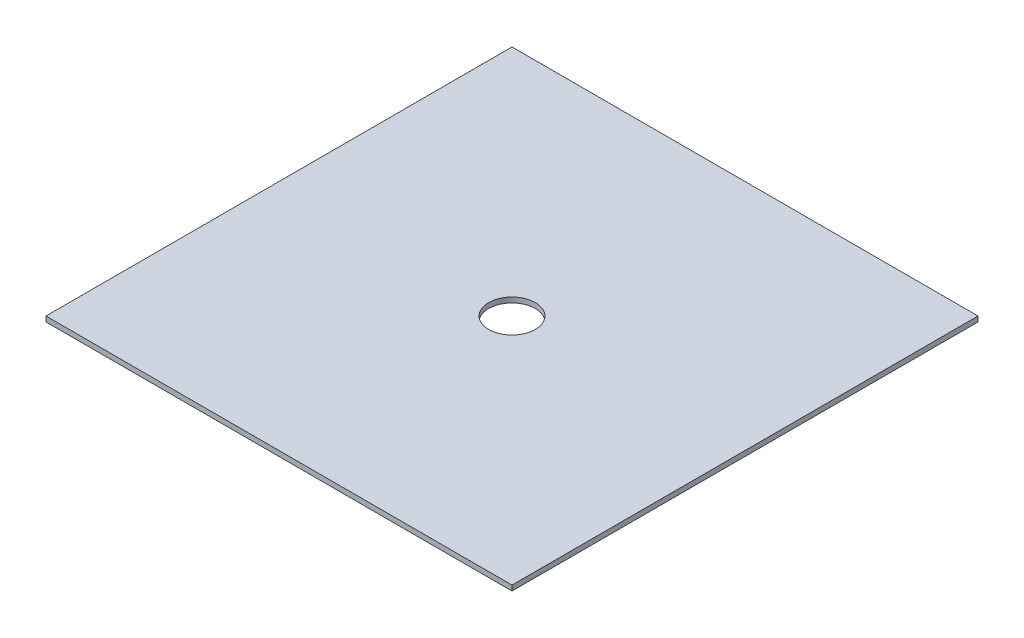
ISO-10303-21;
HEADER;
FILE_DESCRIPTION(('STEP AP214'),'2;1');
FILE_NAME('part.step','',(''),(''),'','','');
FILE_SCHEMA(('AUTOMOTIVE_DESIGN { 1 0 10303 214 1 1 1 1 }'));
ENDSEC;
DATA;
#1=APPLICATION_CONTEXT('core data for automotive mechanical design processes');
#2=APPLICATION_PROTOCOL_DEFINITION('international standard','automotive_design',2000,#1);
#3=PRODUCT_CONTEXT('',#1,'mechanical');
#4=PRODUCT('Part','Part','',(#3));
#5=PRODUCT_RELATED_PRODUCT_CATEGORY('part','',(#4));
#6=PRODUCT_DEFINITION_FORMATION('','',#4);
#7=PRODUCT_DEFINITION_CONTEXT('part definition',#1,'design');
#8=PRODUCT_DEFINITION('design','',#6,#7);
#9=PRODUCT_DEFINITION_SHAPE('','',#8);
#10=(LENGTH_UNIT() NAMED_UNIT(*) SI_UNIT(.MILLI.,.METRE.));
#11=(NAMED_UNIT(*) PLANE_ANGLE_UNIT() SI_UNIT($,.RADIAN.));
#12=(NAMED_UNIT(*) SI_UNIT($,.STERADIAN.) SOLID_ANGLE_UNIT());
#13=UNCERTAINTY_MEASURE_WITH_UNIT(LENGTH_MEASURE(1.E-05),#10,'distance_accuracy_value','');
#14=(GEOMETRIC_REPRESENTATION_CONTEXT(3) GLOBAL_UNCERTAINTY_ASSIGNED_CONTEXT((#13)) GLOBAL_UNIT_ASSIGNED_CONTEXT((#10,
#11,#12)) REPRESENTATION_CONTEXT('',''));
#15=CARTESIAN_POINT('',(0.,0.,0.));
#16=DIRECTION('',(0.,0.,1.));
#17=DIRECTION('',(1.,0.,0.));
#18=AXIS2_PLACEMENT_3D('',#15,#16,#17);
#19=CARTESIAN_POINT('',(0.,6.35,0.));
#20=DIRECTION('',(0.,1.,0.));
#21=DIRECTION('',(0.,0.,1.));
#22=AXIS2_PLACEMENT_3D('',#19,#20,#21);
#23=PLANE('',#22);
#24=DIRECTION('',(0.,0.,1.));
#25=VECTOR('',#24,1.);
#26=CARTESIAN_POINT('',(-285.75,6.35,-285.75));
#27=LINE('',#26,#25);
#28=CARTESIAN_POINT('',(-285.75,6.35,-285.75));
#29=VERTEX_POINT('',#28);
#30=CARTESIAN_POINT('',(-285.75,6.35,285.75));
#31=VERTEX_POINT('',#30);
#32=EDGE_CURVE('E86',#29,#31,#27,.T.);
#33=ORIENTED_EDGE('',*,*,#32,.T.);
#34=DIRECTION('',(1.,0.,0.));
#35=VECTOR('',#34,1.);
#36=CARTESIAN_POINT('',(-285.75,6.35,285.75));
#37=LINE('',#36,#35);
#38=CARTESIAN_POINT('',(285.75,6.35,285.75));
#39=VERTEX_POINT('',#38);
#40=EDGE_CURVE('E81',#31,#39,#37,.T.);
#41=ORIENTED_EDGE('',*,*,#40,.T.);
#42=DIRECTION('',(0.,0.,-1.));
#43=VECTOR('',#42,1.);
#44=CARTESIAN_POINT('',(285.75,6.35,-285.75));
#45=LINE('',#44,#43);
#46=CARTESIAN_POINT('',(285.75,6.35,-285.75));
#47=VERTEX_POINT('',#46);
#48=EDGE_CURVE('E84',#39,#47,#45,.T.);
#49=ORIENTED_EDGE('',*,*,#48,.T.);
#50=DIRECTION('',(-1.,0.,0.));
#51=VECTOR('',#50,1.);
#52=CARTESIAN_POINT('',(-285.75,6.35,-285.75));
#53=LINE('',#52,#51);
#54=EDGE_CURVE('E51',#47,#29,#53,.T.);
#55=ORIENTED_EDGE('',*,*,#54,.T.);
#56=EDGE_LOOP('',(#33,#41,#49,#55));
#57=FACE_BOUND('',#56,.T.);
#58=CARTESIAN_POINT('',(0.,6.35,0.));
#59=DIRECTION('',(0.,1.,0.));
#60=DIRECTION('',(0.,0.,1.));
#61=AXIS2_PLACEMENT_3D('',#58,#59,#60);
#62=CIRCLE('',#61,28.575);
#63=CARTESIAN_POINT('',(0.,6.35,28.575));
#64=VERTEX_POINT('',#63);
#65=EDGE_CURVE('E101',#64,#64,#62,.T.);
#66=ORIENTED_EDGE('',*,*,#65,.F.);
#67=EDGE_LOOP('',(#66));
#68=FACE_BOUND('',#67,.T.);
#69=ADVANCED_FACE('F34',(#57,#68),#23,.T.);
#70=CARTESIAN_POINT('',(0.,0.,0.));
#71=DIRECTION('',(0.,1.,0.));
#72=DIRECTION('',(0.,0.,1.));
#73=AXIS2_PLACEMENT_3D('',#70,#71,#72);
#74=PLANE('',#73);
#75=DIRECTION('',(0.,0.,1.));
#76=VECTOR('',#75,1.);
#77=CARTESIAN_POINT('',(-285.75,0.,-285.75));
#78=LINE('',#77,#76);
#79=CARTESIAN_POINT('',(-285.75,0.,-285.75));
#80=VERTEX_POINT('',#79);
#81=CARTESIAN_POINT('',(-285.75,0.,285.75));
#82=VERTEX_POINT('',#81);
#83=EDGE_CURVE('E98',#80,#82,#78,.T.);
#84=ORIENTED_EDGE('',*,*,#83,.F.);
#85=DIRECTION('',(-1.,0.,0.));
#86=VECTOR('',#85,1.);
#87=CARTESIAN_POINT('',(-285.75,0.,-285.75));
#88=LINE('',#87,#86);
#89=CARTESIAN_POINT('',(285.75,0.,-285.75));
#90=VERTEX_POINT('',#89);
#91=EDGE_CURVE('E74',#90,#80,#88,.T.);
#92=ORIENTED_EDGE('',*,*,#91,.F.);
#93=DIRECTION('',(0.,0.,-1.));
#94=VECTOR('',#93,1.);
#95=CARTESIAN_POINT('',(285.75,0.,-285.75));
#96=LINE('',#95,#94);
#97=CARTESIAN_POINT('',(285.75,0.,285.75));
#98=VERTEX_POINT('',#97);
#99=EDGE_CURVE('E68',#98,#90,#96,.T.);
#100=ORIENTED_EDGE('',*,*,#99,.F.);
#101=DIRECTION('',(1.,0.,0.));
#102=VECTOR('',#101,1.);
#103=CARTESIAN_POINT('',(-285.75,0.,285.75));
#104=LINE('',#103,#102);
#105=EDGE_CURVE('E90',#82,#98,#104,.T.);
#106=ORIENTED_EDGE('',*,*,#105,.F.);
#107=EDGE_LOOP('',(#84,#92,#100,#106));
#108=FACE_BOUND('',#107,.T.);
#109=CARTESIAN_POINT('',(0.,0.,0.));
#110=DIRECTION('',(0.,1.,0.));
#111=DIRECTION('',(0.,0.,1.));
#112=AXIS2_PLACEMENT_3D('',#109,#110,#111);
#113=CIRCLE('',#112,28.575);
#114=CARTESIAN_POINT('',(0.,0.,28.575));
#115=VERTEX_POINT('',#114);
#116=EDGE_CURVE('E113',#115,#115,#113,.T.);
#117=ORIENTED_EDGE('',*,*,#116,.T.);
#118=EDGE_LOOP('',(#117));
#119=FACE_BOUND('',#118,.T.);
#120=ADVANCED_FACE('F109',(#108,#119),#74,.F.);
#121=CARTESIAN_POINT('',(-285.75,6.35,-285.75));
#122=DIRECTION('',(1.,0.,0.));
#123=DIRECTION('',(0.,0.,-1.));
#124=AXIS2_PLACEMENT_3D('',#121,#122,#123);
#125=PLANE('',#124);
#126=ORIENTED_EDGE('',*,*,#83,.T.);
#127=DIRECTION('',(0.,-1.,0.));
#128=VECTOR('',#127,1.);
#129=CARTESIAN_POINT('',(-285.75,6.35,285.75));
#130=LINE('',#129,#128);
#131=EDGE_CURVE('E11',#31,#82,#130,.T.);
#132=ORIENTED_EDGE('',*,*,#131,.F.);
#133=ORIENTED_EDGE('',*,*,#32,.F.);
#134=DIRECTION('',(0.,-1.,0.));
#135=VECTOR('',#134,1.);
#136=CARTESIAN_POINT('',(-285.75,6.35,-285.75));
#137=LINE('',#136,#135);
#138=EDGE_CURVE('E94',#29,#80,#137,.T.);
#139=ORIENTED_EDGE('',*,*,#138,.T.);
#140=EDGE_LOOP('',(#126,#132,#133,#139));
#141=FACE_BOUND('',#140,.T.);
#142=ADVANCED_FACE('F36',(#141),#125,.F.);
#143=CARTESIAN_POINT('',(-285.75,6.35,285.75));
#144=DIRECTION('',(0.,0.,-1.));
#145=DIRECTION('',(-1.,0.,0.));
#146=AXIS2_PLACEMENT_3D('',#143,#144,#145);
#147=PLANE('',#146);
#148=ORIENTED_EDGE('',*,*,#105,.T.);
#149=DIRECTION('',(0.,-1.,0.));
#150=VECTOR('',#149,1.);
#151=CARTESIAN_POINT('',(285.75,6.35,285.75));
#152=LINE('',#151,#150);
#153=EDGE_CURVE('E43',#39,#98,#152,.T.);
#154=ORIENTED_EDGE('',*,*,#153,.F.);
#155=ORIENTED_EDGE('',*,*,#40,.F.);
#156=ORIENTED_EDGE('',*,*,#131,.T.);
#157=EDGE_LOOP('',(#148,#154,#155,#156));
#158=FACE_BOUND('',#157,.T.);
#159=ADVANCED_FACE('F89',(#158),#147,.F.);
#160=CARTESIAN_POINT('',(285.75,6.35,-285.75));
#161=DIRECTION('',(-1.,0.,0.));
#162=DIRECTION('',(0.,0.,1.));
#163=AXIS2_PLACEMENT_3D('',#160,#161,#162);
#164=PLANE('',#163);
#165=ORIENTED_EDGE('',*,*,#99,.T.);
#166=DIRECTION('',(0.,-1.,0.));
#167=VECTOR('',#166,1.);
#168=CARTESIAN_POINT('',(285.75,6.35,-285.75));
#169=LINE('',#168,#167);
#170=EDGE_CURVE('E91',#47,#90,#169,.T.);
#171=ORIENTED_EDGE('',*,*,#170,.F.);
#172=ORIENTED_EDGE('',*,*,#48,.F.);
#173=ORIENTED_EDGE('',*,*,#153,.T.);
#174=EDGE_LOOP('',(#165,#171,#172,#173));
#175=FACE_BOUND('',#174,.T.);
#176=ADVANCED_FACE('F92',(#175),#164,.F.);
#177=CARTESIAN_POINT('',(-285.75,6.35,-285.75));
#178=DIRECTION('',(0.,0.,1.));
#179=DIRECTION('',(1.,0.,0.));
#180=AXIS2_PLACEMENT_3D('',#177,#178,#179);
#181=PLANE('',#180);
#182=ORIENTED_EDGE('',*,*,#91,.T.);
#183=ORIENTED_EDGE('',*,*,#138,.F.);
#184=ORIENTED_EDGE('',*,*,#54,.F.);
#185=ORIENTED_EDGE('',*,*,#170,.T.);
#186=EDGE_LOOP('',(#182,#183,#184,#185));
#187=FACE_BOUND('',#186,.T.);
#188=ADVANCED_FACE('F106',(#187),#181,.F.);
#189=CARTESIAN_POINT('',(0.,6.35,0.));
#190=DIRECTION('',(0.,-1.,0.));
#191=DIRECTION('',(0.,0.,-1.));
#192=AXIS2_PLACEMENT_3D('',#189,#190,#191);
#193=CYLINDRICAL_SURFACE('',#192,28.575);
#194=ORIENTED_EDGE('',*,*,#65,.T.);
#195=EDGE_LOOP('',(#194));
#196=FACE_BOUND('',#195,.T.);
#197=ORIENTED_EDGE('',*,*,#116,.F.);
#198=EDGE_LOOP('',(#197));
#199=FACE_BOUND('',#198,.T.);
#200=ADVANCED_FACE('F119',(#196,#199),#193,.F.);
#201=CLOSED_SHELL('',(#69,#120,#142,#159,#176,#188,#200));
#202=MANIFOLD_SOLID_BREP('B2',#201);
#203=ADVANCED_BREP_SHAPE_REPRESENTATION('',(#18,#202),#14);
#204=SHAPE_DEFINITION_REPRESENTATION(#9,#203);
ENDSEC;
END-ISO-10303-21;
